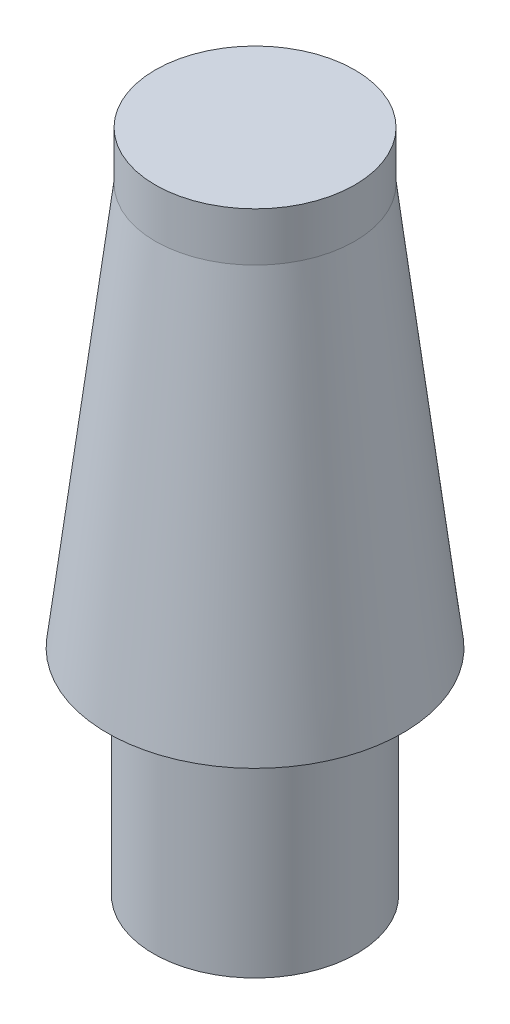
ISO-10303-21;
HEADER;
FILE_DESCRIPTION(('STEP AP214'),'2;1');
FILE_NAME('part.step','',(''),(''),'','','');
FILE_SCHEMA(('AUTOMOTIVE_DESIGN { 1 0 10303 214 1 1 1 1 }'));
ENDSEC;
DATA;
#1=APPLICATION_CONTEXT('core data for automotive mechanical design processes');
#2=APPLICATION_PROTOCOL_DEFINITION('international standard','automotive_design',2000,#1);
#3=PRODUCT_CONTEXT('',#1,'mechanical');
#4=PRODUCT('Part','Part','',(#3));
#5=PRODUCT_RELATED_PRODUCT_CATEGORY('part','',(#4));
#6=PRODUCT_DEFINITION_FORMATION('','',#4);
#7=PRODUCT_DEFINITION_CONTEXT('part definition',#1,'design');
#8=PRODUCT_DEFINITION('design','',#6,#7);
#9=PRODUCT_DEFINITION_SHAPE('','',#8);
#10=(LENGTH_UNIT() NAMED_UNIT(*) SI_UNIT(.MILLI.,.METRE.));
#11=(NAMED_UNIT(*) PLANE_ANGLE_UNIT() SI_UNIT($,.RADIAN.));
#12=(NAMED_UNIT(*) SI_UNIT($,.STERADIAN.) SOLID_ANGLE_UNIT());
#13=UNCERTAINTY_MEASURE_WITH_UNIT(LENGTH_MEASURE(1.E-05),#10,'distance_accuracy_value','');
#14=(GEOMETRIC_REPRESENTATION_CONTEXT(3) GLOBAL_UNCERTAINTY_ASSIGNED_CONTEXT((#13)) GLOBAL_UNIT_ASSIGNED_CONTEXT((#10,
#11,#12)) REPRESENTATION_CONTEXT('',''));
#15=CARTESIAN_POINT('',(0.,0.,0.));
#16=DIRECTION('',(0.,0.,1.));
#17=DIRECTION('',(1.,0.,0.));
#18=AXIS2_PLACEMENT_3D('',#15,#16,#17);
#19=CARTESIAN_POINT('',(34.925,0.,0.));
#20=DIRECTION('',(0.,-1.,0.));
#21=DIRECTION('',(0.,0.,-1.));
#22=AXIS2_PLACEMENT_3D('',#19,#20,#21);
#23=PLANE('',#22);
#24=CARTESIAN_POINT('',(0.,0.,0.));
#25=DIRECTION('',(0.,-1.,0.));
#26=DIRECTION('',(0.,0.,-1.));
#27=AXIS2_PLACEMENT_3D('',#24,#25,#26);
#28=CIRCLE('',#27,30.48);
#29=CARTESIAN_POINT('',(0.,0.,-30.48));
#30=VERTEX_POINT('',#29);
#31=EDGE_CURVE('E60',#30,#30,#28,.T.);
#32=ORIENTED_EDGE('',*,*,#31,.F.);
#33=EDGE_LOOP('',(#32));
#34=FACE_BOUND('',#33,.T.);
#35=CARTESIAN_POINT('',(0.,0.,0.));
#36=DIRECTION('',(0.,-1.,0.));
#37=DIRECTION('',(0.,0.,-1.));
#38=AXIS2_PLACEMENT_3D('',#35,#36,#37);
#39=CIRCLE('',#38,34.925);
#40=CARTESIAN_POINT('',(0.,0.,-34.925));
#41=VERTEX_POINT('',#40);
#42=EDGE_CURVE('E10',#41,#41,#39,.T.);
#43=ORIENTED_EDGE('',*,*,#42,.T.);
#44=EDGE_LOOP('',(#43));
#45=FACE_BOUND('',#44,.T.);
#46=ADVANCED_FACE('F35',(#34,#45),#23,.T.);
#47=CARTESIAN_POINT('',(0.,0.,0.));
#48=DIRECTION('',(0.,-1.,0.));
#49=DIRECTION('',(0.,0.,-1.));
#50=AXIS2_PLACEMENT_3D('',#47,#48,#49);
#51=CYLINDRICAL_SURFACE('',#50,34.925);
#52=CARTESIAN_POINT('',(0.,73.66,0.));
#53=DIRECTION('',(0.,-1.,0.));
#54=DIRECTION('',(0.,0.,-1.));
#55=AXIS2_PLACEMENT_3D('',#52,#53,#54);
#56=CIRCLE('',#55,34.925);
#57=CARTESIAN_POINT('',(0.,73.66,-34.925));
#58=VERTEX_POINT('',#57);
#59=EDGE_CURVE('E41',#58,#58,#56,.T.);
#60=ORIENTED_EDGE('',*,*,#59,.T.);
#61=EDGE_LOOP('',(#60));
#62=FACE_BOUND('',#61,.T.);
#63=ORIENTED_EDGE('',*,*,#42,.F.);
#64=EDGE_LOOP('',(#63));
#65=FACE_BOUND('',#64,.T.);
#66=ADVANCED_FACE('F67',(#62,#65),#51,.T.);
#67=CARTESIAN_POINT('',(34.925,73.66,0.));
#68=DIRECTION('',(0.,-1.,0.));
#69=DIRECTION('',(0.,0.,-1.));
#70=AXIS2_PLACEMENT_3D('',#67,#68,#69);
#71=PLANE('',#70);
#72=CARTESIAN_POINT('',(0.,73.66,0.));
#73=DIRECTION('',(0.,-1.,0.));
#74=DIRECTION('',(0.,0.,-1.));
#75=AXIS2_PLACEMENT_3D('',#72,#73,#74);
#76=CIRCLE('',#75,50.8);
#77=CARTESIAN_POINT('',(0.,73.66,-50.8));
#78=VERTEX_POINT('',#77);
#79=EDGE_CURVE('E45',#78,#78,#76,.T.);
#80=ORIENTED_EDGE('',*,*,#79,.T.);
#81=EDGE_LOOP('',(#80));
#82=FACE_BOUND('',#81,.T.);
#83=ORIENTED_EDGE('',*,*,#59,.F.);
#84=EDGE_LOOP('',(#83));
#85=FACE_BOUND('',#84,.T.);
#86=ADVANCED_FACE('F71',(#82,#85),#71,.T.);
#87=CARTESIAN_POINT('',(0.,73.66,0.));
#88=DIRECTION('',(0.,-1.,0.));
#89=DIRECTION('',(0.,0.,-1.));
#90=AXIS2_PLACEMENT_3D('',#87,#88,#89);
#91=CONICAL_SURFACE('',#90,50.8,0.118921495833547);
#92=CARTESIAN_POINT('',(0.,211.836,0.));
#93=DIRECTION('',(0.,-1.,0.));
#94=DIRECTION('',(0.,0.,-1.));
#95=AXIS2_PLACEMENT_3D('',#92,#93,#94);
#96=CIRCLE('',#95,34.29);
#97=CARTESIAN_POINT('',(0.,211.836,-34.29));
#98=VERTEX_POINT('',#97);
#99=EDGE_CURVE('E49',#98,#98,#96,.T.);
#100=ORIENTED_EDGE('',*,*,#99,.T.);
#101=EDGE_LOOP('',(#100));
#102=FACE_BOUND('',#101,.T.);
#103=ORIENTED_EDGE('',*,*,#79,.F.);
#104=EDGE_LOOP('',(#103));
#105=FACE_BOUND('',#104,.T.);
#106=ADVANCED_FACE('F75',(#102,#105),#91,.T.);
#107=CARTESIAN_POINT('',(0.,0.,0.));
#108=DIRECTION('',(0.,-1.,0.));
#109=DIRECTION('',(0.,0.,-1.));
#110=AXIS2_PLACEMENT_3D('',#107,#108,#109);
#111=CYLINDRICAL_SURFACE('',#110,34.29);
#112=CARTESIAN_POINT('',(0.,228.6,0.));
#113=DIRECTION('',(0.,-1.,0.));
#114=DIRECTION('',(0.,0.,-1.));
#115=AXIS2_PLACEMENT_3D('',#112,#113,#114);
#116=CIRCLE('',#115,34.29);
#117=CARTESIAN_POINT('',(0.,228.6,-34.29));
#118=VERTEX_POINT('',#117);
#119=EDGE_CURVE('E54',#118,#118,#116,.T.);
#120=ORIENTED_EDGE('',*,*,#119,.T.);
#121=EDGE_LOOP('',(#120));
#122=FACE_BOUND('',#121,.T.);
#123=ORIENTED_EDGE('',*,*,#99,.F.);
#124=EDGE_LOOP('',(#123));
#125=FACE_BOUND('',#124,.T.);
#126=ADVANCED_FACE('F82',(#122,#125),#111,.T.);
#127=CARTESIAN_POINT('',(34.29,228.6,0.));
#128=DIRECTION('',(0.,1.,0.));
#129=DIRECTION('',(0.,0.,1.));
#130=AXIS2_PLACEMENT_3D('',#127,#128,#129);
#131=PLANE('',#130);
#132=ORIENTED_EDGE('',*,*,#119,.F.);
#133=EDGE_LOOP('',(#132));
#134=FACE_BOUND('',#133,.T.);
#135=ADVANCED_FACE('F86',(#134),#131,.T.);
#136=CARTESIAN_POINT('',(0.,159.870458762264,0.));
#137=DIRECTION('',(0.,-1.,0.));
#138=DIRECTION('',(0.,0.,-1.));
#139=AXIS2_PLACEMENT_3D('',#136,#137,#138);
#140=CYLINDRICAL_SURFACE('',#139,30.48);
#141=CARTESIAN_POINT('',(0.,73.66,0.));
#142=DIRECTION('',(0.,-1.,0.));
#143=DIRECTION('',(0.,0.,-1.));
#144=AXIS2_PLACEMENT_3D('',#141,#142,#143);
#145=CIRCLE('',#144,30.48);
#146=CARTESIAN_POINT('',(0.,73.66,-30.48));
#147=VERTEX_POINT('',#146);
#148=EDGE_CURVE('E57',#147,#147,#145,.F.);
#149=ORIENTED_EDGE('',*,*,#148,.T.);
#150=EDGE_LOOP('',(#149));
#151=FACE_BOUND('',#150,.T.);
#152=ORIENTED_EDGE('',*,*,#31,.T.);
#153=EDGE_LOOP('',(#152));
#154=FACE_BOUND('',#153,.T.);
#155=ADVANCED_FACE('F64',(#151,#154),#140,.F.);
#156=CARTESIAN_POINT('',(34.925,73.66,0.));
#157=DIRECTION('',(0.,-1.,0.));
#158=DIRECTION('',(0.,0.,-1.));
#159=AXIS2_PLACEMENT_3D('',#156,#157,#158);
#160=PLANE('',#159);
#161=ORIENTED_EDGE('',*,*,#148,.F.);
#162=EDGE_LOOP('',(#161));
#163=FACE_BOUND('',#162,.T.);
#164=ADVANCED_FACE('F93',(#163),#160,.T.);
#165=CLOSED_SHELL('',(#46,#66,#86,#106,#126,#135,#155,#164));
#166=MANIFOLD_SOLID_BREP('B2',#165);
#167=ADVANCED_BREP_SHAPE_REPRESENTATION('',(#18,#166),#14);
#168=SHAPE_DEFINITION_REPRESENTATION(#9,#167);
ENDSEC;
END-ISO-10303-21;
